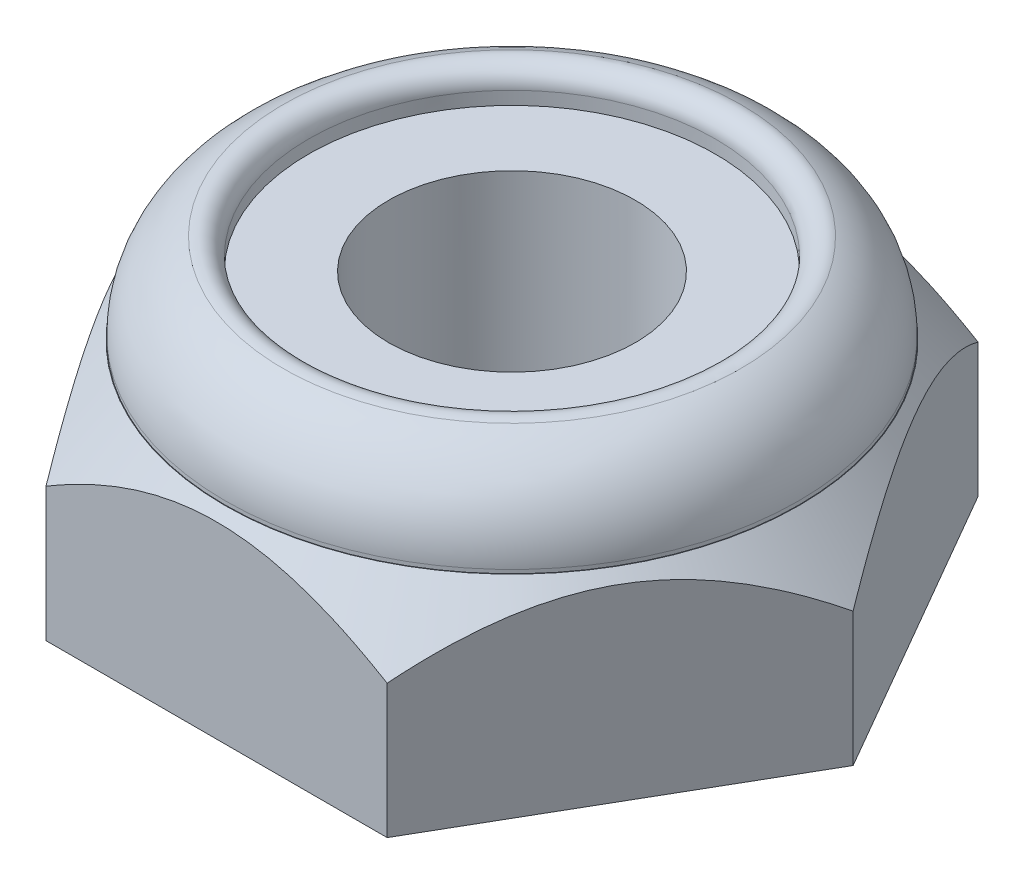
ISO-10303-21;
HEADER;
FILE_DESCRIPTION(('STEP AP214'),'2;1');
FILE_NAME('part.step','',(''),(''),'','','');
FILE_SCHEMA(('AUTOMOTIVE_DESIGN { 1 0 10303 214 1 1 1 1 }'));
ENDSEC;
DATA;
#1=APPLICATION_CONTEXT('core data for automotive mechanical design processes');
#2=APPLICATION_PROTOCOL_DEFINITION('international standard','automotive_design',2000,#1);
#3=PRODUCT_CONTEXT('',#1,'mechanical');
#4=PRODUCT('Part','Part','',(#3));
#5=PRODUCT_RELATED_PRODUCT_CATEGORY('part','',(#4));
#6=PRODUCT_DEFINITION_FORMATION('','',#4);
#7=PRODUCT_DEFINITION_CONTEXT('part definition',#1,'design');
#8=PRODUCT_DEFINITION('design','',#6,#7);
#9=PRODUCT_DEFINITION_SHAPE('','',#8);
#10=(LENGTH_UNIT() NAMED_UNIT(*) SI_UNIT(.MILLI.,.METRE.));
#11=(NAMED_UNIT(*) PLANE_ANGLE_UNIT() SI_UNIT($,.RADIAN.));
#12=(NAMED_UNIT(*) SI_UNIT($,.STERADIAN.) SOLID_ANGLE_UNIT());
#13=UNCERTAINTY_MEASURE_WITH_UNIT(LENGTH_MEASURE(1.E-05),#10,'distance_accuracy_value','');
#14=(GEOMETRIC_REPRESENTATION_CONTEXT(3) GLOBAL_UNCERTAINTY_ASSIGNED_CONTEXT((#13)) GLOBAL_UNIT_ASSIGNED_CONTEXT((#10,
#11,#12)) REPRESENTATION_CONTEXT('',''));
#15=CARTESIAN_POINT('',(0.,0.,0.));
#16=DIRECTION('',(0.,0.,1.));
#17=DIRECTION('',(1.,0.,0.));
#18=AXIS2_PLACEMENT_3D('',#15,#16,#17);
#19=CARTESIAN_POINT('',(2.34315,3.6576,4.05845484975502));
#20=DIRECTION('',(-0.866025403784439,0.,-0.499999999999999));
#21=DIRECTION('',(-0.499999999999999,0.,0.866025403784439));
#22=AXIS2_PLACEMENT_3D('',#19,#20,#21);
#23=PLANE('',#22);
#24=DIRECTION('',(-0.499999999999999,0.,0.866025403784439));
#25=VECTOR('',#24,1.);
#26=CARTESIAN_POINT('',(4.6863,0.935355,0.));
#27=LINE('',#26,#25);
#28=CARTESIAN_POINT('',(4.6863,0.935355,0.));
#29=VERTEX_POINT('',#28);
#30=CARTESIAN_POINT('',(2.34315000000001,0.935355,4.05845484975502));
#31=VERTEX_POINT('',#30);
#32=EDGE_CURVE('E92',#29,#31,#27,.T.);
#33=ORIENTED_EDGE('',*,*,#32,.F.);
#34=DIRECTION('',(0.,1.,0.));
#35=VECTOR('',#34,1.);
#36=CARTESIAN_POINT('',(4.6863,3.6576,0.));
#37=LINE('',#36,#35);
#38=CARTESIAN_POINT('',(4.68630000001419,2.7730459340105,-2.45821360759307E-11));
#39=VERTEX_POINT('',#38);
#40=EDGE_CURVE('E202',#29,#39,#37,.T.);
#41=ORIENTED_EDGE('',*,*,#40,.T.);
#42=CARTESIAN_POINT('',(2.3431499999612,2.77304593398822,4.05845484979446));
#43=CARTESIAN_POINT('',(2.37767282857321,2.81418235889091,3.99865955663499));
#44=CARTESIAN_POINT('',(2.41249219710801,2.85432113110729,3.93835064125267));
#45=CARTESIAN_POINT('',(2.48278735558791,2.93230661020917,3.816595855245));
#46=CARTESIAN_POINT('',(2.51826344805563,2.97015222462005,3.75514946063508));
#47=CARTESIAN_POINT('',(2.62615438114571,3.08018701500149,3.56827688284408));
#48=CARTESIAN_POINT('',(2.69961665995557,3.14837015576206,3.44103648350706));
#49=CARTESIAN_POINT('',(2.84967035002766,3.2709277860951,3.18113586844006));
#50=CARTESIAN_POINT('',(2.9262705606761,3.32525984886677,3.04846041172609));
#51=CARTESIAN_POINT('',(3.08197408348711,3.41577217646148,2.77877399929969));
#52=CARTESIAN_POINT('',(3.16107001756274,3.45200143013376,2.64177582280869));
#53=CARTESIAN_POINT('',(3.291984148038,3.49372811243503,2.41502589739689));
#54=CARTESIAN_POINT('',(3.34330313980485,3.50560413715319,2.32613879626348));
#55=CARTESIAN_POINT('',(3.44628593291413,3.52008140702853,2.14776736629285));
#56=CARTESIAN_POINT('',(3.49794979165912,3.52268106753121,2.05828293803146));
#57=CARTESIAN_POINT('',(3.60089965448859,3.51847006524789,1.87996854497858));
#58=CARTESIAN_POINT('',(3.6521861911469,3.51171021118306,1.79113765774214));
#59=CARTESIAN_POINT('',(3.75425802291053,3.48921023555425,1.61434405910591));
#60=CARTESIAN_POINT('',(3.80504329284943,3.47346966541741,1.52638139129562));
#61=CARTESIAN_POINT('',(3.91981939865521,3.42817062222156,1.32758334454512));
#62=CARTESIAN_POINT('',(3.98355100422862,3.39598542076133,1.21719696564403));
#63=CARTESIAN_POINT('',(4.10926833260345,3.32004827846255,0.999448165506999));
#64=CARTESIAN_POINT('',(4.17125308037794,3.27629001415058,0.892087433067251));
#65=CARTESIAN_POINT('',(4.293560931701,3.17910361386979,0.680244020411125));
#66=CARTESIAN_POINT('',(4.35387635261756,3.12563730731956,0.575774646903749));
#67=CARTESIAN_POINT('',(4.47261995679412,3.01104764609313,0.370104691396086));
#68=CARTESIAN_POINT('',(4.53104876910239,2.94992687749399,0.268903019852268));
#69=CARTESIAN_POINT('',(4.60505373907431,2.86741854625153,0.140722651848287));
#70=CARTESIAN_POINT('',(4.62142679893417,2.84883596648691,0.112363680295636));
#71=CARTESIAN_POINT('',(4.6539878423698,2.81125673907332,0.055966298717677));
#72=CARTESIAN_POINT('',(4.67017623558396,2.79226151161516,0.0279271791778412));
#73=CARTESIAN_POINT('',(4.6863000000283,2.77304593399368,-4.90273860582746E-11));
#74=B_SPLINE_CURVE_WITH_KNOTS('',3,(#42,#43,#44,#45,#46,#47,#48,#49,#50,#51,#52,#53,#54,#55,#56,
#57,#58,#59,#60,#61,#62,#63,#64,#65,#66,#67,#68,#69,#70,#71,#72,#73),.UNSPECIFIED.,.F.,.F.,(4,2,
2,2,2,2,2,2,2,2,2,2,2,2,2,4),(0.,0.241096809088565,0.48230758945251,0.967637153847363,
1.45443592242802,1.93991010956962,2.24950193433617,2.5591466432483,2.86711700071402,
3.17510274216897,3.56882084711335,3.9627545240326,4.35827201930639,4.75365624679114,
4.86660838982692,4.97921936905084),.UNSPECIFIED.);
#75=CARTESIAN_POINT('',(2.34315000001419,2.77304593399358,4.05845484977959));
#76=VERTEX_POINT('',#75);
#77=EDGE_CURVE('E137',#76,#39,#74,.T.);
#78=ORIENTED_EDGE('',*,*,#77,.F.);
#79=DIRECTION('',(0.,1.,0.));
#80=VECTOR('',#79,1.);
#81=CARTESIAN_POINT('',(2.34315000000001,3.6576,4.05845484975502));
#82=LINE('',#81,#80);
#83=EDGE_CURVE('E128',#76,#31,#82,.F.);
#84=ORIENTED_EDGE('',*,*,#83,.T.);
#85=EDGE_LOOP('',(#33,#41,#78,#84));
#86=FACE_BOUND('',#85,.T.);
#87=ADVANCED_FACE('F40',(#86),#23,.F.);
#88=CARTESIAN_POINT('',(-2.34315,3.6576,4.05845484975501));
#89=DIRECTION('',(0.,0.,-1.));
#90=DIRECTION('',(-1.,0.,0.));
#91=AXIS2_PLACEMENT_3D('',#88,#89,#90);
#92=PLANE('',#91);
#93=DIRECTION('',(-1.,0.,0.));
#94=VECTOR('',#93,1.);
#95=CARTESIAN_POINT('',(2.34315000000001,0.935355,4.05845484975502));
#96=LINE('',#95,#94);
#97=CARTESIAN_POINT('',(-2.34315,0.935355,4.05845484975502));
#98=VERTEX_POINT('',#97);
#99=EDGE_CURVE('E102',#31,#98,#96,.T.);
#100=ORIENTED_EDGE('',*,*,#99,.F.);
#101=ORIENTED_EDGE('',*,*,#83,.F.);
#102=CARTESIAN_POINT('',(-2.34315000005357,2.77304593398822,4.05845484974113));
#103=CARTESIAN_POINT('',(-2.27415972170409,2.81414935271336,4.05845484974989));
#104=CARTESIAN_POINT('',(-2.20457738522044,2.85425669884705,4.05845484975361));
#105=CARTESIAN_POINT('',(-2.06410193528096,2.93218331968193,4.05845484975642));
#106=CARTESIAN_POINT('',(-1.99320821641151,2.9700015013142,4.05845484975551));
#107=CARTESIAN_POINT('',(-1.77754688772429,3.07999086386455,4.05845484975401));
#108=CARTESIAN_POINT('',(-1.63068545869954,3.1481589403704,4.05845484975469));
#109=CARTESIAN_POINT('',(-1.33052752457963,3.27077676919262,4.05845484975534));
#110=CARTESIAN_POINT('',(-1.17720631609342,3.32516696804196,4.0584548497553));
#111=CARTESIAN_POINT('',(-0.865613503807779,3.41574608766059,4.05845484975473));
#112=CARTESIAN_POINT('',(-0.707359229311903,3.45199244874899,4.0584548497542));
#113=CARTESIAN_POINT('',(-0.456822143345071,3.49192146546895,4.05845484975548));
#114=CARTESIAN_POINT('',(-0.365672921156202,3.50290887295604,4.05845484975637));
#115=CARTESIAN_POINT('',(-0.183016322004482,3.51758027913678,4.05845484975366));
#116=CARTESIAN_POINT('',(-0.0915105175250817,3.52128341037061,4.05845484975007));
#117=CARTESIAN_POINT('',(0.104649468641441,3.52128177491765,4.0584548497495));
#118=CARTESIAN_POINT('',(0.209305100872023,3.51643705333648,4.05845484975354));
#119=CARTESIAN_POINT('',(0.417787181909869,3.49730239560235,4.05845484975649));
#120=CARTESIAN_POINT('',(0.521613181352877,3.48300765111694,4.05845484975541));
#121=CARTESIAN_POINT('',(0.728332544913562,3.44553375886282,4.05845484975462));
#122=CARTESIAN_POINT('',(0.831215331558566,3.42229697724238,4.05845484975491));
#123=CARTESIAN_POINT('',(1.03487580391125,3.36791830054733,4.05845484975512));
#124=CARTESIAN_POINT('',(1.13565289468809,3.33677420321768,4.05845484975504));
#125=CARTESIAN_POINT('',(1.33273383822163,3.26838741918099,4.05845484975499));
#126=CARTESIAN_POINT('',(1.42908716226035,3.23128582684656,4.05845484975501));
#127=CARTESIAN_POINT('',(1.61947291708309,3.15151071591982,4.05845484975502));
#128=CARTESIAN_POINT('',(1.71350470709807,3.10883567899407,4.05845484975502));
#129=CARTESIAN_POINT('',(1.89803195382395,3.01941532331662,4.05845484975501));
#130=CARTESIAN_POINT('',(1.98855798046432,2.97273255726059,4.05845484975502));
#131=CARTESIAN_POINT('',(2.16742834958163,2.87556944084479,4.05845484975502));
#132=CARTESIAN_POINT('',(2.25577492892455,2.82509321932285,4.05845484975502));
#133=CARTESIAN_POINT('',(2.34315000005566,2.77304593399424,4.05845484975502));
#134=B_SPLINE_CURVE_WITH_KNOTS('',3,(#102,#103,#104,#105,#106,#107,#108,#109,#110,#111,#112,
#113,#114,#115,#116,#117,#118,#119,#120,#121,#122,#123,#124,#125,#126,#127,#128,#129,#130,#131,
#132,#133),.UNSPECIFIED.,.F.,.F.,(4,2,2,2,2,2,2,2,2,2,2,2,2,2,2,4),(0.,0.24090330355952,
0.481920744736242,0.967059466968448,1.4542606837498,1.93990959177135,2.21507934695766,
2.4895253838939,2.80337599596431,3.11738642360394,3.43345557972405,3.74961286055439,
4.0591611810716,4.36879400620232,4.67425708545867,4.97939238068026),.UNSPECIFIED.);
#135=CARTESIAN_POINT('',(-2.34315000001419,2.77304593399358,4.05845484977959));
#136=VERTEX_POINT('',#135);
#137=EDGE_CURVE('E86',#136,#76,#134,.T.);
#138=ORIENTED_EDGE('',*,*,#137,.F.);
#139=DIRECTION('',(0.,1.,0.));
#140=VECTOR('',#139,1.);
#141=CARTESIAN_POINT('',(-2.34315,3.6576,4.05845484975501));
#142=LINE('',#141,#140);
#143=EDGE_CURVE('E118',#136,#98,#142,.F.);
#144=ORIENTED_EDGE('',*,*,#143,.T.);
#145=EDGE_LOOP('',(#100,#101,#138,#144));
#146=FACE_BOUND('',#145,.T.);
#147=ADVANCED_FACE('F123',(#146),#92,.F.);
#148=CARTESIAN_POINT('',(-4.6863,3.6576,0.));
#149=DIRECTION('',(0.866025403784439,0.,-0.5));
#150=DIRECTION('',(-0.5,0.,-0.866025403784439));
#151=AXIS2_PLACEMENT_3D('',#148,#149,#150);
#152=PLANE('',#151);
#153=DIRECTION('',(-0.500000000000001,0.,-0.866025403784438));
#154=VECTOR('',#153,1.);
#155=CARTESIAN_POINT('',(-2.34315,0.935355,4.05845484975502));
#156=LINE('',#155,#154);
#157=CARTESIAN_POINT('',(-4.68630000000001,0.935355,0.));
#158=VERTEX_POINT('',#157);
#159=EDGE_CURVE('E106',#98,#158,#156,.T.);
#160=ORIENTED_EDGE('',*,*,#159,.F.);
#161=ORIENTED_EDGE('',*,*,#143,.F.);
#162=CARTESIAN_POINT('',(-4.68630000001476,2.77304593398821,-5.3333815551093E-11));
#163=CARTESIAN_POINT('',(-4.65177717141793,2.81418235889091,0.0597952931149053));
#164=CARTESIAN_POINT('',(-4.61695780288956,2.85432113110728,0.120104208500933));
#165=CARTESIAN_POINT('',(-4.54666264441453,2.93230661020916,0.241858994511412));
#166=CARTESIAN_POINT('',(-4.51118655194523,2.97015222462005,0.303305389120424));
#167=CARTESIAN_POINT('',(-4.40329561885259,3.08018701500149,0.490177966909938));
#168=CARTESIAN_POINT('',(-4.32983334004397,3.14837015576205,0.617418366247689));
#169=CARTESIAN_POINT('',(-4.1797796499728,3.27092778609509,0.877318981315214));
#170=CARTESIAN_POINT('',(-4.10317943932402,3.32525984886677,1.00999443802899));
#171=CARTESIAN_POINT('',(-3.94747591651278,3.41577217646147,1.27968085045525));
#172=CARTESIAN_POINT('',(-3.86837998243724,3.45200143013375,1.4166790269463));
#173=CARTESIAN_POINT('',(-3.73746585196202,3.49372811243502,1.64342895235813));
#174=CARTESIAN_POINT('',(-3.68614686019516,3.50560413715319,1.73231605349153));
#175=CARTESIAN_POINT('',(-3.58316406708587,3.52008140702852,1.91068748346216));
#176=CARTESIAN_POINT('',(-3.53150020834088,3.5226810675312,2.00017191172355));
#177=CARTESIAN_POINT('',(-3.42855034551142,3.51847006524789,2.17848630477643));
#178=CARTESIAN_POINT('',(-3.3772638088531,3.51171021118305,2.26731719201287));
#179=CARTESIAN_POINT('',(-3.27519197708947,3.48921023555424,2.4441107906491));
#180=CARTESIAN_POINT('',(-3.22440670715057,3.4734696654174,2.53207345845939));
#181=CARTESIAN_POINT('',(-3.10963060134479,3.42817062222156,2.73087150520989));
#182=CARTESIAN_POINT('',(-3.04589899577138,3.39598542076133,2.84125788411098));
#183=CARTESIAN_POINT('',(-2.92018166739655,3.32004827846255,3.05900668424801));
#184=CARTESIAN_POINT('',(-2.85819691962206,3.27629001415058,3.16636741668776));
#185=CARTESIAN_POINT('',(-2.735889068299,3.17910361386979,3.37821082934389));
#186=CARTESIAN_POINT('',(-2.67557364738244,3.12563730731956,3.48268020285126));
#187=CARTESIAN_POINT('',(-2.55683004320588,3.01104764609313,3.68835015835892));
#188=CARTESIAN_POINT('',(-2.49840123089761,2.94992687749399,3.78955182990274));
#189=CARTESIAN_POINT('',(-2.42439626092569,2.86741854625153,3.91773219790672));
#190=CARTESIAN_POINT('',(-2.40802320106583,2.84883596648691,3.94609116945937));
#191=CARTESIAN_POINT('',(-2.3754621576302,2.81125673907332,4.00248855103733));
#192=CARTESIAN_POINT('',(-2.35927376441604,2.79226151161516,4.03052767057717));
#193=CARTESIAN_POINT('',(-2.3431499999717,2.77304593399368,4.05845484980404));
#194=B_SPLINE_CURVE_WITH_KNOTS('',3,(#162,#163,#164,#165,#166,#167,#168,#169,#170,#171,#172,
#173,#174,#175,#176,#177,#178,#179,#180,#181,#182,#183,#184,#185,#186,#187,#188,#189,#190,#191,
#192,#193),.UNSPECIFIED.,.F.,.F.,(4,2,2,2,2,2,2,2,2,2,2,2,2,2,2,4),(0.,0.241096809088565,
0.48230758945251,0.967637153847365,1.45443592242802,1.93991010956963,2.24950193433618,
2.5591466432483,2.86711700071403,3.17510274216898,3.56882084711336,3.96275452403261,
4.35827201930639,4.75365624679115,4.86660838982693,4.97921936905084),.UNSPECIFIED.);
#195=CARTESIAN_POINT('',(-4.68630000002839,2.77304593399358,0.));
#196=VERTEX_POINT('',#195);
#197=EDGE_CURVE('E125',#196,#136,#194,.T.);
#198=ORIENTED_EDGE('',*,*,#197,.F.);
#199=DIRECTION('',(0.,1.,0.));
#200=VECTOR('',#199,1.);
#201=CARTESIAN_POINT('',(-4.6863,3.6576,0.));
#202=LINE('',#201,#200);
#203=EDGE_CURVE('E120',#196,#158,#202,.F.);
#204=ORIENTED_EDGE('',*,*,#203,.T.);
#205=EDGE_LOOP('',(#160,#161,#198,#204));
#206=FACE_BOUND('',#205,.T.);
#207=ADVANCED_FACE('F116',(#206),#152,.F.);
#208=CARTESIAN_POINT('',(-2.34315,3.6576,-4.05845484975502));
#209=DIRECTION('',(0.866025403784438,0.,0.5));
#210=DIRECTION('',(0.5,0.,-0.866025403784438));
#211=AXIS2_PLACEMENT_3D('',#208,#209,#210);
#212=PLANE('',#211);
#213=DIRECTION('',(0.499999999999999,0.,-0.866025403784439));
#214=VECTOR('',#213,1.);
#215=CARTESIAN_POINT('',(-4.68630000000001,0.935355,0.));
#216=LINE('',#215,#214);
#217=CARTESIAN_POINT('',(-2.34315000000001,0.935355,-4.05845484975502));
#218=VERTEX_POINT('',#217);
#219=EDGE_CURVE('E121',#158,#218,#216,.T.);
#220=ORIENTED_EDGE('',*,*,#219,.F.);
#221=ORIENTED_EDGE('',*,*,#203,.F.);
#222=CARTESIAN_POINT('',(-2.3431499999612,2.77304593398821,-4.05845484979447));
#223=CARTESIAN_POINT('',(-2.37767282857321,2.81418235889091,-3.99865955663499));
#224=CARTESIAN_POINT('',(-2.41249219710802,2.85432113110728,-3.93835064125268));
#225=CARTESIAN_POINT('',(-2.48278735558791,2.93230661020916,-3.81659585524501));
#226=CARTESIAN_POINT('',(-2.51826344805563,2.97015222462005,-3.75514946063508));
#227=CARTESIAN_POINT('',(-2.62615438114571,3.08018701500149,-3.56827688284409));
#228=CARTESIAN_POINT('',(-2.69961665995557,3.14837015576205,-3.44103648350706));
#229=CARTESIAN_POINT('',(-2.84967035002766,3.27092778609509,-3.18113586844007));
#230=CARTESIAN_POINT('',(-2.9262705606761,3.32525984886676,-3.0484604117261));
#231=CARTESIAN_POINT('',(-3.08197408348711,3.41577217646147,-2.7787739992997));
#232=CARTESIAN_POINT('',(-3.16107001756274,3.45200143013375,-2.6417758228087));
#233=CARTESIAN_POINT('',(-3.291984148038,3.49372811243502,-2.4150258973969));
#234=CARTESIAN_POINT('',(-3.34330313980485,3.50560413715318,-2.32613879626349));
#235=CARTESIAN_POINT('',(-3.44628593291413,3.52008140702852,-2.14776736629286));
#236=CARTESIAN_POINT('',(-3.49794979165912,3.5226810675312,-2.05828293803147));
#237=CARTESIAN_POINT('',(-3.60089965448859,3.51847006524788,-1.87996854497859));
#238=CARTESIAN_POINT('',(-3.6521861911469,3.51171021118305,-1.79113765774214));
#239=CARTESIAN_POINT('',(-3.75425802291053,3.48921023555424,-1.61434405910592));
#240=CARTESIAN_POINT('',(-3.80504329284944,3.4734696654174,-1.52638139129563));
#241=CARTESIAN_POINT('',(-3.91981939865521,3.42817062222155,-1.32758334454512));
#242=CARTESIAN_POINT('',(-3.98355100422863,3.39598542076132,-1.21719696564403));
#243=CARTESIAN_POINT('',(-4.10926833260346,3.32004827846254,-0.999448165507007));
#244=CARTESIAN_POINT('',(-4.17125308037794,3.27629001415057,-0.892087433067258));
#245=CARTESIAN_POINT('',(-4.29356093170101,3.17910361386978,-0.680244020411132));
#246=CARTESIAN_POINT('',(-4.35387635261756,3.12563730731955,-0.575774646903757));
#247=CARTESIAN_POINT('',(-4.47261995679413,3.01104764609312,-0.370104691396094));
#248=CARTESIAN_POINT('',(-4.53104876910239,2.94992687749399,-0.268903019852276));
#249=CARTESIAN_POINT('',(-4.60505373907432,2.86741854625152,-0.140722651848295));
#250=CARTESIAN_POINT('',(-4.62142679893418,2.84883596648691,-0.112363680295645));
#251=CARTESIAN_POINT('',(-4.6539878423698,2.81125673907331,-0.0559662987176857));
#252=CARTESIAN_POINT('',(-4.67017623558397,2.79226151161515,-0.0279271791778497));
#253=CARTESIAN_POINT('',(-4.68630000002831,2.77304593399367,4.90190782069009E-11));
#254=B_SPLINE_CURVE_WITH_KNOTS('',3,(#222,#223,#224,#225,#226,#227,#228,#229,#230,#231,#232,
#233,#234,#235,#236,#237,#238,#239,#240,#241,#242,#243,#244,#245,#246,#247,#248,#249,#250,#251,
#252,#253),.UNSPECIFIED.,.F.,.F.,(4,2,2,2,2,2,2,2,2,2,2,2,2,2,2,4),(0.,0.241096809088564,
0.482307589452509,0.967637153847362,1.45443592242802,1.93991010956962,2.24950193433617,
2.5591466432483,2.86711700071402,3.17510274216897,3.56882084711335,3.9627545240326,
4.35827201930639,4.75365624679114,4.86660838982692,4.97921936905084),.UNSPECIFIED.);
#255=CARTESIAN_POINT('',(-2.34315000001419,2.77304593399358,-4.0584548497796));
#256=VERTEX_POINT('',#255);
#257=EDGE_CURVE('E124',#256,#196,#254,.T.);
#258=ORIENTED_EDGE('',*,*,#257,.F.);
#259=DIRECTION('',(0.,1.,0.));
#260=VECTOR('',#259,1.);
#261=CARTESIAN_POINT('',(-2.34315,3.6576,-4.05845484975502));
#262=LINE('',#261,#260);
#263=EDGE_CURVE('E211',#256,#218,#262,.F.);
#264=ORIENTED_EDGE('',*,*,#263,.T.);
#265=EDGE_LOOP('',(#220,#221,#258,#264));
#266=FACE_BOUND('',#265,.T.);
#267=ADVANCED_FACE('F228',(#266),#212,.F.);
#268=CARTESIAN_POINT('',(2.34315,3.6576,-4.05845484975502));
#269=DIRECTION('',(0.,0.,1.));
#270=DIRECTION('',(1.,0.,0.));
#271=AXIS2_PLACEMENT_3D('',#268,#269,#270);
#272=PLANE('',#271);
#273=DIRECTION('',(1.,0.,0.));
#274=VECTOR('',#273,1.);
#275=CARTESIAN_POINT('',(-2.34315000000001,0.935355,-4.05845484975502));
#276=LINE('',#275,#274);
#277=CARTESIAN_POINT('',(2.34315,0.935355,-4.05845484975501));
#278=VERTEX_POINT('',#277);
#279=EDGE_CURVE('E57',#218,#278,#276,.T.);
#280=ORIENTED_EDGE('',*,*,#279,.F.);
#281=ORIENTED_EDGE('',*,*,#263,.F.);
#282=CARTESIAN_POINT('',(2.34315000005357,2.77304593398821,-4.05845484974114));
#283=CARTESIAN_POINT('',(2.27415972170409,2.81414935271335,-4.05845484974989));
#284=CARTESIAN_POINT('',(2.20457738522045,2.85425669884704,-4.05845484975361));
#285=CARTESIAN_POINT('',(2.06410193528096,2.93218331968193,-4.05845484975643));
#286=CARTESIAN_POINT('',(1.99320821641151,2.97000150131419,-4.05845484975552));
#287=CARTESIAN_POINT('',(1.77754688772429,3.07999086386454,-4.05845484975402));
#288=CARTESIAN_POINT('',(1.63068545869954,3.1481589403704,-4.0584548497547));
#289=CARTESIAN_POINT('',(1.33052752457963,3.27077676919261,-4.05845484975534));
#290=CARTESIAN_POINT('',(1.17720631609342,3.32516696804195,-4.0584548497553));
#291=CARTESIAN_POINT('',(0.865613503807778,3.41574608766058,-4.05845484975474));
#292=CARTESIAN_POINT('',(0.707359229311901,3.45199244874898,-4.0584548497542));
#293=CARTESIAN_POINT('',(0.456822143345069,3.49192146546895,-4.05845484975548));
#294=CARTESIAN_POINT('',(0.365672921156201,3.50290887295604,-4.05845484975637));
#295=CARTESIAN_POINT('',(0.183016322004481,3.51758027913677,-4.05845484975367));
#296=CARTESIAN_POINT('',(0.0915105175250814,3.5212834103706,-4.05845484975008));
#297=CARTESIAN_POINT('',(-0.104649468641441,3.52128177491764,-4.0584548497495));
#298=CARTESIAN_POINT('',(-0.209305100872023,3.51643705333648,-4.05845484975354));
#299=CARTESIAN_POINT('',(-0.41778718190987,3.49730239560234,-4.0584548497565));
#300=CARTESIAN_POINT('',(-0.521613181352877,3.48300765111693,-4.05845484975542));
#301=CARTESIAN_POINT('',(-0.728332544913562,3.44553375886281,-4.05845484975462));
#302=CARTESIAN_POINT('',(-0.831215331558566,3.42229697724237,-4.05845484975491));
#303=CARTESIAN_POINT('',(-1.03487580391125,3.36791830054732,-4.05845484975513));
#304=CARTESIAN_POINT('',(-1.13565289468809,3.33677420321767,-4.05845484975505));
#305=CARTESIAN_POINT('',(-1.33273383822163,3.26838741918098,-4.05845484975499));
#306=CARTESIAN_POINT('',(-1.42908716226035,3.23128582684655,-4.05845484975501));
#307=CARTESIAN_POINT('',(-1.61947291708309,3.15151071591982,-4.05845484975503));
#308=CARTESIAN_POINT('',(-1.71350470709807,3.10883567899406,-4.05845484975502));
#309=CARTESIAN_POINT('',(-1.89803195382395,3.01941532331662,-4.05845484975502));
#310=CARTESIAN_POINT('',(-1.98855798046431,2.97273255726059,-4.05845484975502));
#311=CARTESIAN_POINT('',(-2.16742834958162,2.87556944084479,-4.05845484975502));
#312=CARTESIAN_POINT('',(-2.25577492892455,2.82509321932284,-4.05845484975502));
#313=CARTESIAN_POINT('',(-2.34315000005566,2.77304593399424,-4.05845484975502));
#314=B_SPLINE_CURVE_WITH_KNOTS('',3,(#282,#283,#284,#285,#286,#287,#288,#289,#290,#291,#292,
#293,#294,#295,#296,#297,#298,#299,#300,#301,#302,#303,#304,#305,#306,#307,#308,#309,#310,#311,
#312,#313),.UNSPECIFIED.,.F.,.F.,(4,2,2,2,2,2,2,2,2,2,2,2,2,2,2,4),(0.,0.24090330355952,
0.481920744736243,0.96705946696845,1.4542606837498,1.93990959177135,2.21507934695766,
2.48952538389391,2.80337599596432,3.11738642360394,3.43345557972405,3.74961286055439,
4.0591611810716,4.36879400620232,4.67425708545866,4.97939238068026),.UNSPECIFIED.);
#315=CARTESIAN_POINT('',(2.34315000001419,2.77304593399358,-4.0584548497796));
#316=VERTEX_POINT('',#315);
#317=EDGE_CURVE('E66',#316,#256,#314,.T.);
#318=ORIENTED_EDGE('',*,*,#317,.F.);
#319=DIRECTION('',(0.,1.,0.));
#320=VECTOR('',#319,1.);
#321=CARTESIAN_POINT('',(2.34315,3.6576,-4.05845484975501));
#322=LINE('',#321,#320);
#323=EDGE_CURVE('E210',#316,#278,#322,.F.);
#324=ORIENTED_EDGE('',*,*,#323,.T.);
#325=EDGE_LOOP('',(#280,#281,#318,#324));
#326=FACE_BOUND('',#325,.T.);
#327=ADVANCED_FACE('F221',(#326),#272,.F.);
#328=CARTESIAN_POINT('',(4.6863,3.6576,0.));
#329=DIRECTION('',(-0.866025403784439,0.,0.5));
#330=DIRECTION('',(0.5,0.,0.866025403784439));
#331=AXIS2_PLACEMENT_3D('',#328,#329,#330);
#332=PLANE('',#331);
#333=DIRECTION('',(0.5,0.,0.866025403784438));
#334=VECTOR('',#333,1.);
#335=CARTESIAN_POINT('',(2.34315,0.935355,-4.05845484975502));
#336=LINE('',#335,#334);
#337=EDGE_CURVE('E95',#278,#29,#336,.T.);
#338=ORIENTED_EDGE('',*,*,#337,.F.);
#339=ORIENTED_EDGE('',*,*,#323,.F.);
#340=CARTESIAN_POINT('',(4.68630000001476,2.77304593398822,5.33267015141622E-11));
#341=CARTESIAN_POINT('',(4.65177717141792,2.81418235889091,-0.0597952931149122));
#342=CARTESIAN_POINT('',(4.61695780288956,2.85432113110729,-0.12010420850094));
#343=CARTESIAN_POINT('',(4.54666264441452,2.93230661020917,-0.241858994511418));
#344=CARTESIAN_POINT('',(4.51118655194522,2.97015222462005,-0.303305389120429));
#345=CARTESIAN_POINT('',(4.40329561885258,3.0801870150015,-0.490177966909942));
#346=CARTESIAN_POINT('',(4.32983334004397,3.14837015576206,-0.617418366247694));
#347=CARTESIAN_POINT('',(4.1797796499728,3.27092778609509,-0.877318981315217));
#348=CARTESIAN_POINT('',(4.10317943932402,3.32525984886677,-1.00999443802899));
#349=CARTESIAN_POINT('',(3.94747591651277,3.41577217646148,-1.27968085045525));
#350=CARTESIAN_POINT('',(3.86837998243724,3.45200143013375,-1.4166790269463));
#351=CARTESIAN_POINT('',(3.73746585196202,3.49372811243502,-1.64342895235813));
#352=CARTESIAN_POINT('',(3.68614686019516,3.50560413715319,-1.73231605349153));
#353=CARTESIAN_POINT('',(3.58316406708587,3.52008140702852,-1.91068748346216));
#354=CARTESIAN_POINT('',(3.53150020834088,3.5226810675312,-2.00017191172355));
#355=CARTESIAN_POINT('',(3.42855034551142,3.51847006524789,-2.17848630477643));
#356=CARTESIAN_POINT('',(3.3772638088531,3.51171021118306,-2.26731719201287));
#357=CARTESIAN_POINT('',(3.27519197708948,3.48921023555424,-2.4441107906491));
#358=CARTESIAN_POINT('',(3.22440670715057,3.4734696654174,-2.53207345845939));
#359=CARTESIAN_POINT('',(3.10963060134479,3.42817062222156,-2.73087150520989));
#360=CARTESIAN_POINT('',(3.04589899577138,3.39598542076133,-2.84125788411098));
#361=CARTESIAN_POINT('',(2.92018166739655,3.32004827846255,-3.05900668424801));
#362=CARTESIAN_POINT('',(2.85819691962206,3.27629001415058,-3.16636741668776));
#363=CARTESIAN_POINT('',(2.735889068299,3.17910361386979,-3.37821082934388));
#364=CARTESIAN_POINT('',(2.67557364738245,3.12563730731956,-3.48268020285126));
#365=CARTESIAN_POINT('',(2.55683004320588,3.01104764609313,-3.68835015835892));
#366=CARTESIAN_POINT('',(2.49840123089762,2.94992687749399,-3.78955182990274));
#367=CARTESIAN_POINT('',(2.42439626092569,2.86741854625153,-3.91773219790672));
#368=CARTESIAN_POINT('',(2.40802320106583,2.84883596648691,-3.94609116945937));
#369=CARTESIAN_POINT('',(2.3754621576302,2.81125673907332,-4.00248855103733));
#370=CARTESIAN_POINT('',(2.35927376441604,2.79226151161516,-4.03052767057717));
#371=CARTESIAN_POINT('',(2.3431499999717,2.77304593399368,-4.05845484980404));
#372=B_SPLINE_CURVE_WITH_KNOTS('',3,(#340,#341,#342,#343,#344,#345,#346,#347,#348,#349,#350,
#351,#352,#353,#354,#355,#356,#357,#358,#359,#360,#361,#362,#363,#364,#365,#366,#367,#368,#369,
#370,#371),.UNSPECIFIED.,.F.,.F.,(4,2,2,2,2,2,2,2,2,2,2,2,2,2,2,4),(0.,0.241096809088564,
0.482307589452508,0.96763715384736,1.45443592242801,1.93991010956962,2.24950193433616,
2.55914664324829,2.86711700071401,3.17510274216896,3.56882084711335,3.96275452403259,
4.35827201930638,4.75365624679113,4.86660838982692,4.97921936905084),.UNSPECIFIED.);
#373=EDGE_CURVE('E203',#39,#316,#372,.T.);
#374=ORIENTED_EDGE('',*,*,#373,.F.);
#375=ORIENTED_EDGE('',*,*,#40,.F.);
#376=EDGE_LOOP('',(#338,#339,#374,#375));
#377=FACE_BOUND('',#376,.T.);
#378=ADVANCED_FACE('F217',(#377),#332,.F.);
#379=CARTESIAN_POINT('',(0.,0.,0.));
#380=DIRECTION('',(0.,1.,0.));
#381=DIRECTION('',(0.,0.,1.));
#382=AXIS2_PLACEMENT_3D('',#379,#380,#381);
#383=CYLINDRICAL_SURFACE('',#382,1.69545);
#384=CARTESIAN_POINT('',(0.,4.4704,0.));
#385=DIRECTION('',(0.,1.,0.));
#386=DIRECTION('',(0.,0.,1.));
#387=AXIS2_PLACEMENT_3D('',#384,#385,#386);
#388=CIRCLE('',#387,1.69545);
#389=CARTESIAN_POINT('',(0.,4.4704,1.69545));
#390=VERTEX_POINT('',#389);
#391=EDGE_CURVE('E11',#390,#390,#388,.F.);
#392=ORIENTED_EDGE('',*,*,#391,.F.);
#393=EDGE_LOOP('',(#392));
#394=FACE_BOUND('',#393,.T.);
#395=CARTESIAN_POINT('',(0.,0.935355,0.));
#396=DIRECTION('',(0.,-1.,0.));
#397=DIRECTION('',(0.,0.,-1.));
#398=AXIS2_PLACEMENT_3D('',#395,#396,#397);
#399=CIRCLE('',#398,1.69545);
#400=CARTESIAN_POINT('',(0.,0.935355,-1.69545));
#401=VERTEX_POINT('',#400);
#402=EDGE_CURVE('E44',#401,#401,#399,.F.);
#403=ORIENTED_EDGE('',*,*,#402,.F.);
#404=EDGE_LOOP('',(#403));
#405=FACE_BOUND('',#404,.T.);
#406=ADVANCED_FACE('F161',(#394,#405),#383,.F.);
#407=CARTESIAN_POINT('',(0.,4.9784,0.));
#408=DIRECTION('',(0.,-1.,0.));
#409=DIRECTION('',(0.,0.,-1.));
#410=AXIS2_PLACEMENT_3D('',#407,#408,#409);
#411=CYLINDRICAL_SURFACE('',#410,3.937);
#412=CARTESIAN_POINT('',(0.,3.7084,0.));
#413=DIRECTION('',(0.,1.,0.));
#414=DIRECTION('',(0.,0.,1.));
#415=AXIS2_PLACEMENT_3D('',#412,#413,#414);
#416=CIRCLE('',#415,3.937);
#417=CARTESIAN_POINT('',(0.,3.7084,3.937));
#418=VERTEX_POINT('',#417);
#419=EDGE_CURVE('E192',#418,#418,#416,.T.);
#420=ORIENTED_EDGE('',*,*,#419,.F.);
#421=EDGE_LOOP('',(#420));
#422=FACE_BOUND('',#421,.T.);
#423=CARTESIAN_POINT('',(0.,3.6576,0.));
#424=DIRECTION('',(0.,-1.,0.));
#425=DIRECTION('',(0.,0.,-1.));
#426=AXIS2_PLACEMENT_3D('',#423,#424,#425);
#427=CIRCLE('',#426,3.937);
#428=CARTESIAN_POINT('',(0.,3.6576,-3.937));
#429=VERTEX_POINT('',#428);
#430=EDGE_CURVE('E190',#429,#429,#427,.F.);
#431=ORIENTED_EDGE('',*,*,#430,.T.);
#432=EDGE_LOOP('',(#431));
#433=FACE_BOUND('',#432,.T.);
#434=ADVANCED_FACE('F42',(#422,#433),#411,.T.);
#435=CARTESIAN_POINT('',(0.,3.7084,0.));
#436=DIRECTION('',(0.,1.,0.));
#437=DIRECTION('',(0.,0.,1.));
#438=AXIS2_PLACEMENT_3D('',#435,#436,#437);
#439=TOROIDAL_SURFACE('',#438,2.667,1.27);
#440=ORIENTED_EDGE('',*,*,#419,.T.);
#441=EDGE_LOOP('',(#440));
#442=FACE_BOUND('',#441,.T.);
#443=CARTESIAN_POINT('',(0.,4.88572150982644,0.));
#444=DIRECTION('',(0.,-1.,0.));
#445=DIRECTION('',(0.,0.,-1.));
#446=AXIS2_PLACEMENT_3D('',#443,#444,#445);
#447=CIRCLE('',#446,3.14325);
#448=CARTESIAN_POINT('',(0.,4.88572150982644,-3.14325));
#449=VERTEX_POINT('',#448);
#450=EDGE_CURVE('E189',#449,#449,#447,.F.);
#451=ORIENTED_EDGE('',*,*,#450,.F.);
#452=EDGE_LOOP('',(#451));
#453=FACE_BOUND('',#452,.T.);
#454=ADVANCED_FACE('F154',(#442,#453),#439,.T.);
#455=CARTESIAN_POINT('',(2.34315,3.6576,4.05845484975502));
#456=DIRECTION('',(0.,-1.,0.));
#457=DIRECTION('',(0.,0.,-1.));
#458=AXIS2_PLACEMENT_3D('',#455,#456,#457);
#459=PLANE('',#458);
#460=ORIENTED_EDGE('',*,*,#430,.F.);
#461=EDGE_LOOP('',(#460));
#462=FACE_BOUND('',#461,.T.);
#463=CARTESIAN_POINT('',(0.,3.65760000011051,0.));
#464=DIRECTION('',(0.,-1.,0.));
#465=DIRECTION('',(0.,0.,-1.));
#466=AXIS2_PLACEMENT_3D('',#463,#464,#465);
#467=CIRCLE('',#466,3.94407100938664);
#468=CARTESIAN_POINT('',(0.,3.65760000011051,-3.94407100938664));
#469=VERTEX_POINT('',#468);
#470=EDGE_CURVE('E138',#469,#469,#467,.T.);
#471=ORIENTED_EDGE('',*,*,#470,.F.);
#472=EDGE_LOOP('',(#471));
#473=FACE_BOUND('',#472,.T.);
#474=ADVANCED_FACE('F149',(#462,#473),#459,.F.);
#475=CARTESIAN_POINT('',(0.,4.65025720786115,0.));
#476=DIRECTION('',(0.,-1.,0.));
#477=DIRECTION('',(0.,0.,-1.));
#478=AXIS2_PLACEMENT_3D('',#475,#476,#477);
#479=TOROIDAL_SURFACE('',#478,3.048,0.254);
#480=CARTESIAN_POINT('',(0.,4.65025720786115,0.));
#481=DIRECTION('',(0.,1.,0.));
#482=DIRECTION('',(0.,0.,1.));
#483=AXIS2_PLACEMENT_3D('',#480,#481,#482);
#484=CIRCLE('',#483,2.794);
#485=CARTESIAN_POINT('',(0.,4.65025720786115,2.794));
#486=VERTEX_POINT('',#485);
#487=EDGE_CURVE('E134',#486,#486,#484,.F.);
#488=ORIENTED_EDGE('',*,*,#487,.T.);
#489=EDGE_LOOP('',(#488));
#490=FACE_BOUND('',#489,.T.);
#491=ORIENTED_EDGE('',*,*,#450,.T.);
#492=EDGE_LOOP('',(#491));
#493=FACE_BOUND('',#492,.T.);
#494=ADVANCED_FACE('F144',(#490,#493),#479,.T.);
#495=CARTESIAN_POINT('',(0.,2.76773860969115,0.));
#496=DIRECTION('',(0.,-1.,0.));
#497=DIRECTION('',(0.,0.,-1.));
#498=AXIS2_PLACEMENT_3D('',#495,#496,#497);
#499=CONICAL_SURFACE('',#498,4.69075337389313,0.698131700802158);
#500=ORIENTED_EDGE('',*,*,#197,.T.);
#501=ORIENTED_EDGE('',*,*,#137,.T.);
#502=ORIENTED_EDGE('',*,*,#77,.T.);
#503=ORIENTED_EDGE('',*,*,#373,.T.);
#504=ORIENTED_EDGE('',*,*,#317,.T.);
#505=ORIENTED_EDGE('',*,*,#257,.T.);
#506=EDGE_LOOP('',(#500,#501,#502,#503,#504,#505));
#507=FACE_BOUND('',#506,.T.);
#508=ORIENTED_EDGE('',*,*,#470,.T.);
#509=EDGE_LOOP('',(#508));
#510=FACE_BOUND('',#509,.T.);
#511=ADVANCED_FACE('F148',(#507,#510),#499,.T.);
#512=CARTESIAN_POINT('',(0.,4.4704,0.));
#513=DIRECTION('',(0.,1.,0.));
#514=DIRECTION('',(0.,0.,1.));
#515=AXIS2_PLACEMENT_3D('',#512,#513,#514);
#516=CYLINDRICAL_SURFACE('',#515,2.794);
#517=ORIENTED_EDGE('',*,*,#487,.F.);
#518=EDGE_LOOP('',(#517));
#519=FACE_BOUND('',#518,.T.);
#520=CARTESIAN_POINT('',(0.,4.4704,0.));
#521=DIRECTION('',(0.,1.,0.));
#522=DIRECTION('',(0.,0.,1.));
#523=AXIS2_PLACEMENT_3D('',#520,#521,#522);
#524=CIRCLE('',#523,2.794);
#525=CARTESIAN_POINT('',(0.,4.4704,2.794));
#526=VERTEX_POINT('',#525);
#527=EDGE_CURVE('E49',#526,#526,#524,.T.);
#528=ORIENTED_EDGE('',*,*,#527,.F.);
#529=EDGE_LOOP('',(#528));
#530=FACE_BOUND('',#529,.T.);
#531=ADVANCED_FACE('F176',(#519,#530),#516,.F.);
#532=CARTESIAN_POINT('',(0.,4.4704,0.));
#533=DIRECTION('',(0.,1.,0.));
#534=DIRECTION('',(0.,0.,1.));
#535=AXIS2_PLACEMENT_3D('',#532,#533,#534);
#536=PLANE('',#535);
#537=ORIENTED_EDGE('',*,*,#391,.T.);
#538=EDGE_LOOP('',(#537));
#539=FACE_BOUND('',#538,.T.);
#540=ORIENTED_EDGE('',*,*,#527,.T.);
#541=EDGE_LOOP('',(#540));
#542=FACE_BOUND('',#541,.T.);
#543=ADVANCED_FACE('F223',(#539,#542),#536,.T.);
#544=CARTESIAN_POINT('',(0.,0.935355,0.));
#545=DIRECTION('',(0.,-1.,0.));
#546=DIRECTION('',(0.,0.,-1.));
#547=AXIS2_PLACEMENT_3D('',#544,#545,#546);
#548=PLANE('',#547);
#549=ORIENTED_EDGE('',*,*,#99,.T.);
#550=ORIENTED_EDGE('',*,*,#159,.T.);
#551=ORIENTED_EDGE('',*,*,#219,.T.);
#552=ORIENTED_EDGE('',*,*,#279,.T.);
#553=ORIENTED_EDGE('',*,*,#337,.T.);
#554=ORIENTED_EDGE('',*,*,#32,.T.);
#555=EDGE_LOOP('',(#549,#550,#551,#552,#553,#554));
#556=FACE_BOUND('',#555,.T.);
#557=ORIENTED_EDGE('',*,*,#402,.T.);
#558=EDGE_LOOP('',(#557));
#559=FACE_BOUND('',#558,.T.);
#560=ADVANCED_FACE('F104',(#556,#559),#548,.T.);
#561=CLOSED_SHELL('',(#87,#147,#207,#267,#327,#378,#406,#434,#454,#474,#494,#511,#531,#543,#560));
#562=MANIFOLD_SOLID_BREP('B2',#561);
#563=ADVANCED_BREP_SHAPE_REPRESENTATION('',(#18,#562),#14);
#564=SHAPE_DEFINITION_REPRESENTATION(#9,#563);
ENDSEC;
END-ISO-10303-21;
